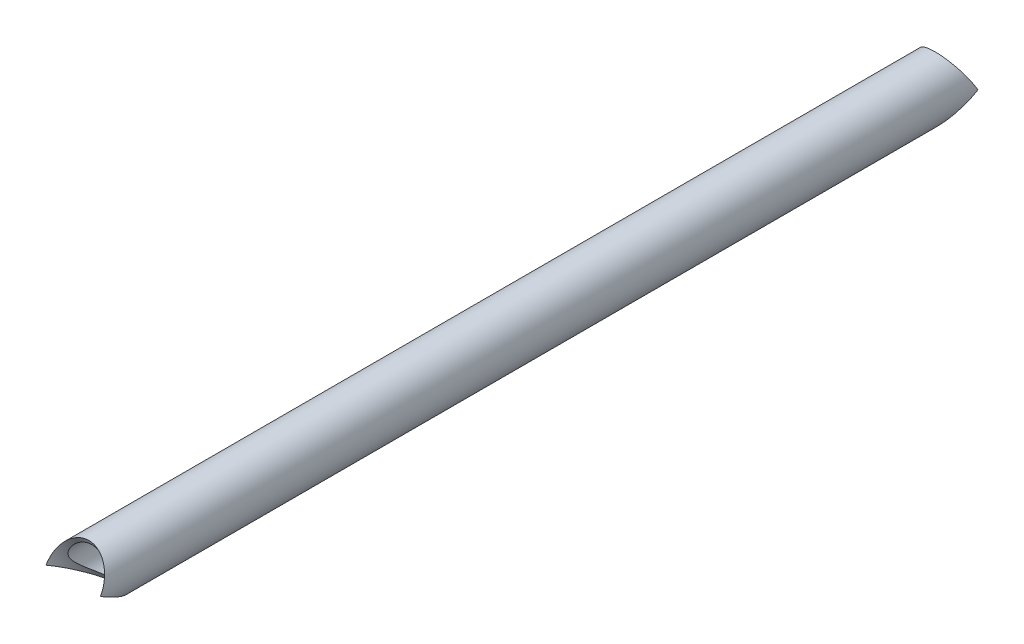
ISO-10303-21;
HEADER;
FILE_DESCRIPTION(('STEP AP214'),'2;1');
FILE_NAME('part.step','',(''),(''),'','','');
FILE_SCHEMA(('AUTOMOTIVE_DESIGN { 1 0 10303 214 1 1 1 1 }'));
ENDSEC;
DATA;
#1=APPLICATION_CONTEXT('core data for automotive mechanical design processes');
#2=APPLICATION_PROTOCOL_DEFINITION('international standard','automotive_design',2000,#1);
#3=PRODUCT_CONTEXT('',#1,'mechanical');
#4=PRODUCT('Part','Part','',(#3));
#5=PRODUCT_RELATED_PRODUCT_CATEGORY('part','',(#4));
#6=PRODUCT_DEFINITION_FORMATION('','',#4);
#7=PRODUCT_DEFINITION_CONTEXT('part definition',#1,'design');
#8=PRODUCT_DEFINITION('design','',#6,#7);
#9=PRODUCT_DEFINITION_SHAPE('','',#8);
#10=(LENGTH_UNIT() NAMED_UNIT(*) SI_UNIT(.MILLI.,.METRE.));
#11=(NAMED_UNIT(*) PLANE_ANGLE_UNIT() SI_UNIT($,.RADIAN.));
#12=(NAMED_UNIT(*) SI_UNIT($,.STERADIAN.) SOLID_ANGLE_UNIT());
#13=UNCERTAINTY_MEASURE_WITH_UNIT(LENGTH_MEASURE(1.E-05),#10,'distance_accuracy_value','');
#14=(GEOMETRIC_REPRESENTATION_CONTEXT(3) GLOBAL_UNCERTAINTY_ASSIGNED_CONTEXT((#13)) GLOBAL_UNIT_ASSIGNED_CONTEXT((#10,
#11,#12)) REPRESENTATION_CONTEXT('',''));
#15=CARTESIAN_POINT('',(0.,0.,0.));
#16=DIRECTION('',(0.,0.,1.));
#17=DIRECTION('',(1.,0.,0.));
#18=AXIS2_PLACEMENT_3D('',#15,#16,#17);
#19=CARTESIAN_POINT('',(0.,-5.32499999998885,-184.224170550283));
#20=DIRECTION('',(0.,0.,1.));
#21=DIRECTION('',(1.,0.,0.));
#22=AXIS2_PLACEMENT_3D('',#19,#20,#21);
#23=CYLINDRICAL_SURFACE('',#22,10.65);
#24=CARTESIAN_POINT('',(0.,-5.32499999998885,-171.925609816544));
#25=DIRECTION('',(0.,0.866025403784403,0.500000000000061));
#26=DIRECTION('',(0.,-0.500000000000061,0.866025403784403));
#27=AXIS2_PLACEMENT_3D('',#24,#25,#26);
#28=ELLIPSE('',#27,21.2999999999974,10.65);
#29=CARTESIAN_POINT('',(-10.65,-5.32499999998885,-171.925609816544));
#30=VERTEX_POINT('',#29);
#31=CARTESIAN_POINT('',(10.65,-5.32499999998885,-171.925609816544));
#32=VERTEX_POINT('',#31);
#33=EDGE_CURVE('E41',#30,#32,#28,.T.);
#34=ORIENTED_EDGE('',*,*,#33,.T.);
#35=CARTESIAN_POINT('',(0.,-5.32499999998885,-171.925609816544));
#36=DIRECTION('',(0.,-0.500000000000061,0.866025403784403));
#37=DIRECTION('',(0.,0.866025403784403,0.500000000000061));
#38=AXIS2_PLACEMENT_3D('',#35,#36,#37);
#39=ELLIPSE('',#38,12.2975607337395,10.65);
#40=EDGE_CURVE('E47',#32,#30,#39,.T.);
#41=ORIENTED_EDGE('',*,*,#40,.T.);
#42=EDGE_LOOP('',(#34,#41));
#43=FACE_BOUND('',#42,.T.);
#44=CARTESIAN_POINT('',(0.,-5.32499999998885,171.925609816544));
#45=DIRECTION('',(0.,-0.866025403784403,0.500000000000061));
#46=DIRECTION('',(0.,-0.500000000000061,-0.866025403784403));
#47=AXIS2_PLACEMENT_3D('',#44,#45,#46);
#48=ELLIPSE('',#47,21.2999999999974,10.65);
#49=CARTESIAN_POINT('',(-10.65,-5.32499999998885,171.925609816544));
#50=VERTEX_POINT('',#49);
#51=CARTESIAN_POINT('',(10.65,-5.32499999998885,171.925609816544));
#52=VERTEX_POINT('',#51);
#53=EDGE_CURVE('E66',#50,#52,#48,.T.);
#54=ORIENTED_EDGE('',*,*,#53,.F.);
#55=CARTESIAN_POINT('',(0.,-5.32499999998885,171.925609816544));
#56=DIRECTION('',(0.,0.500000000000061,0.866025403784403));
#57=DIRECTION('',(0.,0.866025403784403,-0.500000000000061));
#58=AXIS2_PLACEMENT_3D('',#55,#56,#57);
#59=ELLIPSE('',#58,12.2975607337395,10.65);
#60=EDGE_CURVE('E62',#52,#50,#59,.T.);
#61=ORIENTED_EDGE('',*,*,#60,.F.);
#62=EDGE_LOOP('',(#54,#61));
#63=FACE_BOUND('',#62,.T.);
#64=ADVANCED_FACE('F36',(#43,#63),#23,.T.);
#65=CARTESIAN_POINT('',(0.,-5.32499999998885,-184.224170550283));
#66=DIRECTION('',(0.,0.,1.));
#67=DIRECTION('',(1.,0.,0.));
#68=AXIS2_PLACEMENT_3D('',#65,#66,#67);
#69=CYLINDRICAL_SURFACE('',#68,8.65);
#70=CARTESIAN_POINT('',(8.65,-5.32499999998885,-164.751582588643));
#71=CARTESIAN_POINT('',(8.64999937803326,-5.17818391802983,-164.836346880927));
#72=CARTESIAN_POINT('',(8.64626274910706,-5.02875572477534,-164.916598939517));
#73=CARTESIAN_POINT('',(8.63051404007006,-4.72515065143808,-165.066664752137));
#74=CARTESIAN_POINT('',(8.61850310980505,-4.57097443401232,-165.136479954894));
#75=CARTESIAN_POINT('',(8.58549136002908,-4.258977668166,-165.264392027061));
#76=CARTESIAN_POINT('',(8.56450206368755,-4.10116203549409,-165.32250377699));
#77=CARTESIAN_POINT('',(8.51297710355421,-3.78302790283956,-165.426364076008));
#78=CARTESIAN_POINT('',(8.48244146927592,-3.62270941059626,-165.472112663318));
#79=CARTESIAN_POINT('',(8.41148621827915,-3.30100459506672,-165.551150890317));
#80=CARTESIAN_POINT('',(8.37105601253787,-3.13961730920164,-165.58442708501));
#81=CARTESIAN_POINT('',(8.2803069748769,-2.81761051835733,-165.638973092547));
#82=CARTESIAN_POINT('',(8.22998781020885,-2.65699103939996,-165.660242501288));
#83=CARTESIAN_POINT('',(8.11955918288833,-2.33771822962291,-165.691868713454));
#84=CARTESIAN_POINT('',(8.05943008935704,-2.17906954213242,-165.702203318022));
#85=CARTESIAN_POINT('',(7.92980127101956,-1.86529040441174,-165.713292877662));
#86=CARTESIAN_POINT('',(7.86029883349651,-1.7101609879251,-165.714045053469));
#87=CARTESIAN_POINT('',(7.69251740767304,-1.3634301509233,-165.706625782818));
#88=CARTESIAN_POINT('',(7.5915181509432,-1.17319572046901,-165.696008886837));
#89=CARTESIAN_POINT('',(7.37601667855867,-0.801384915047754,-165.664903576289));
#90=CARTESIAN_POINT('',(7.26151062378719,-0.619811022411486,-165.644412349952));
#91=CARTESIAN_POINT('',(7.01974442801425,-0.266185998617423,-165.596289892607));
#92=CARTESIAN_POINT('',(6.89247464409701,-0.0941422220586872,-165.568653238017));
#93=CARTESIAN_POINT('',(6.62602035216088,0.239525172013357,-165.508607871293));
#94=CARTESIAN_POINT('',(6.48683667995883,0.401149519107631,-165.476199493802));
#95=CARTESIAN_POINT('',(6.19369921715697,0.717199408943917,-165.407764760115));
#96=CARTESIAN_POINT('',(6.03946719637204,0.871351742221771,-165.371669240243));
#97=CARTESIAN_POINT('',(5.71996280967908,1.16745458199548,-165.298337988744));
#98=CARTESIAN_POINT('',(5.55469039583109,1.3094050355018,-165.261102252166));
#99=CARTESIAN_POINT('',(5.21389860047888,1.58044322936016,-165.187000834841));
#100=CARTESIAN_POINT('',(5.03838164399918,1.70953399435173,-165.150135068918));
#101=CARTESIAN_POINT('',(4.67787691764106,1.95424676281789,-165.078035733563));
#102=CARTESIAN_POINT('',(4.49288897525142,2.06986852083276,-165.042802193884));
#103=CARTESIAN_POINT('',(4.08963935720716,2.30115050105448,-164.970633423202));
#104=CARTESIAN_POINT('',(3.87018262639214,2.41485316134383,-164.934074544985));
#105=CARTESIAN_POINT('',(3.42170434916094,2.62330748090905,-164.865738468766));
#106=CARTESIAN_POINT('',(3.19268197861112,2.71805750322058,-164.833961683857));
#107=CARTESIAN_POINT('',(2.7266723382205,2.88774898225467,-164.776260503516));
#108=CARTESIAN_POINT('',(2.48968464132695,2.96268937498884,-164.750336422447));
#109=CARTESIAN_POINT('',(2.00954587057522,3.09200831167104,-164.705186159598));
#110=CARTESIAN_POINT('',(1.76639521488977,3.14638824673532,-164.685959524677));
#111=CARTESIAN_POINT('',(1.28688815577943,3.23204637631907,-164.655511643798));
#112=CARTESIAN_POINT('',(1.05071773862522,3.26425324185667,-164.643969360825));
#113=CARTESIAN_POINT('',(0.576287751521727,3.3090696993199,-164.627876538484));
#114=CARTESIAN_POINT('',(0.338028232848643,3.32167977089473,-164.623325827991));
#115=CARTESIAN_POINT('',(-0.138694398066291,3.32717181020632,-164.621345993312));
#116=CARTESIAN_POINT('',(-0.377157454410702,3.32005809031574,-164.623915312416));
#117=CARTESIAN_POINT('',(-0.852499060908972,3.28618555814927,-164.636099206851));
#118=CARTESIAN_POINT('',(-1.08937763950013,3.25942709940566,-164.645713655395));
#119=CARTESIAN_POINT('',(-1.55084699910064,3.18792048411242,-164.671219634468));
#120=CARTESIAN_POINT('',(-1.7755636187999,3.14389120637699,-164.686859931666));
#121=CARTESIAN_POINT('',(-2.22033596035186,3.03830373528607,-164.723988694614));
#122=CARTESIAN_POINT('',(-2.4403918288897,2.97674609447402,-164.745476976018));
#123=CARTESIAN_POINT('',(-2.87439182216489,2.83663978905833,-164.793716157701));
#124=CARTESIAN_POINT('',(-3.08833678882606,2.75809347796042,-164.820466328983));
#125=CARTESIAN_POINT('',(-3.50884695015104,2.58462882673776,-164.878485954288));
#126=CARTESIAN_POINT('',(-3.7154119251496,2.48970999977479,-164.909755542691));
#127=CARTESIAN_POINT('',(-4.12561504865976,2.28132550281853,-164.976824530928));
#128=CARTESIAN_POINT('',(-4.32901148650181,2.16741694086198,-165.012725829159));
#129=CARTESIAN_POINT('',(-4.72560996425249,1.92381198974504,-165.087156214731));
#130=CARTESIAN_POINT('',(-4.91881176220239,1.79411522611015,-165.125685364393));
#131=CARTESIAN_POINT('',(-5.29426000335307,1.51952202324252,-165.204019326205));
#132=CARTESIAN_POINT('',(-5.4764901297915,1.37460378461324,-165.243825909613));
#133=CARTESIAN_POINT('',(-5.82873985001166,1.07050122086712,-165.322975853411));
#134=CARTESIAN_POINT('',(-5.99875927649522,0.91131670035584,-165.362319207448));
#135=CARTESIAN_POINT('',(-6.33518765877074,0.569797671442788,-165.440740789647));
#136=CARTESIAN_POINT('',(-6.50081325634465,0.38665555923292,-165.479670874362));
#137=CARTESIAN_POINT('',(-6.81634213928583,0.00614173896049025,-165.551855359216));
#138=CARTESIAN_POINT('',(-6.96624167784346,-0.191233341360134,-165.585108407952));
#139=CARTESIAN_POINT('',(-7.24880778217058,-0.598626237502179,-165.642302626018));
#140=CARTESIAN_POINT('',(-7.38151120832292,-0.808615550176427,-165.666263939914));
#141=CARTESIAN_POINT('',(-7.62872444595338,-1.24005747420905,-165.700706798244));
#142=CARTESIAN_POINT('',(-7.74324661530789,-1.46150216238931,-165.711197533363));
#143=CARTESIAN_POINT('',(-7.91587661528823,-1.83394120081,-165.713453861845));
#144=CARTESIAN_POINT('',(-7.97965328460164,-1.98229882169847,-165.71051051142));
#145=CARTESIAN_POINT('',(-8.09865941914437,-2.28194667177127,-165.695658752971));
#146=CARTESIAN_POINT('',(-8.15389168150628,-2.43323592291714,-165.683753286341));
#147=CARTESIAN_POINT('',(-8.25543809691553,-2.73735751111757,-165.649851195522));
#148=CARTESIAN_POINT('',(-8.30176915263798,-2.89018633175618,-165.627873971049));
#149=CARTESIAN_POINT('',(-8.38549388456925,-3.19634433804125,-165.572985934839));
#150=CARTESIAN_POINT('',(-8.42288752849283,-3.3496735254932,-165.540075083608));
#151=CARTESIAN_POINT('',(-8.48887463244825,-3.65583736996734,-165.462819916907));
#152=CARTESIAN_POINT('',(-8.51744234753774,-3.80866931716127,-165.418442833481));
#153=CARTESIAN_POINT('',(-8.56590540255694,-4.11200299043332,-165.318457093415));
#154=CARTESIAN_POINT('',(-8.58580081854741,-4.26250473693738,-165.262848535289));
#155=CARTESIAN_POINT('',(-8.61742448664859,-4.56019147254828,-165.140996012762));
#156=CARTESIAN_POINT('',(-8.62914387610778,-4.70737269562372,-165.074740602767));
#157=CARTESIAN_POINT('',(-8.64501885033618,-4.99748069426516,-164.932658779803));
#158=CARTESIAN_POINT('',(-8.64917188260002,-5.14040601811811,-164.856829146197));
#159=CARTESIAN_POINT('',(-8.65091176420886,-5.4819498637693,-164.662429780555));
#160=CARTESIAN_POINT('',(-8.64490991978812,-5.67810720220343,-164.539496812136));
#161=CARTESIAN_POINT('',(-8.62080404537332,-6.06052557384161,-164.28018583847));
#162=CARTESIAN_POINT('',(-8.60269349220145,-6.24678121440884,-164.143800620032));
#163=CARTESIAN_POINT('',(-8.5559159317615,-6.61050738598074,-163.86036625578));
#164=CARTESIAN_POINT('',(-8.52721453919814,-6.78794714118488,-163.713283641723));
#165=CARTESIAN_POINT('',(-8.46048539057335,-7.13436872184306,-163.411410831022));
#166=CARTESIAN_POINT('',(-8.4224538533154,-7.30334708466182,-163.256617529814));
#167=CARTESIAN_POINT('',(-8.33930780952946,-7.62840220803287,-162.9465277733));
#168=CARTESIAN_POINT('',(-8.29446233610359,-7.78471951599551,-162.791409697928));
#169=CARTESIAN_POINT('',(-8.19738755510059,-8.09107106240671,-162.477399875386));
#170=CARTESIAN_POINT('',(-8.1451593511144,-8.24110623558898,-162.31850869518));
#171=CARTESIAN_POINT('',(-8.03358147622644,-8.53574819847153,-161.997939035238));
#172=CARTESIAN_POINT('',(-7.97422521882754,-8.68034980293632,-161.83625809765));
#173=CARTESIAN_POINT('',(-7.84858289044828,-8.96455859803898,-161.511183076435));
#174=CARTESIAN_POINT('',(-7.78229605383354,-9.10416523458176,-161.347788805331));
#175=CARTESIAN_POINT('',(-7.6427878968921,-9.37889196674545,-161.020007469417));
#176=CARTESIAN_POINT('',(-7.56956237191914,-9.51400927412034,-160.855619859886));
#177=CARTESIAN_POINT('',(-7.41613086611596,-9.7800058910372,-160.52664592058));
#178=CARTESIAN_POINT('',(-7.33592422353146,-9.9108847971956,-160.362059573429));
#179=CARTESIAN_POINT('',(-7.1684296718615,-10.1685222937733,-160.033473896981));
#180=CARTESIAN_POINT('',(-7.08114669097994,-10.2952836670593,-159.869474240805));
#181=CARTESIAN_POINT('',(-6.89920629382398,-10.5448944677749,-159.542591380739));
#182=CARTESIAN_POINT('',(-6.80454875727009,-10.6677438313533,-159.379708195105));
#183=CARTESIAN_POINT('',(-6.56519981119286,-10.9615247675292,-158.986076960969));
#184=CARTESIAN_POINT('',(-6.4164866166655,-11.1304340932328,-158.75624248383));
#185=CARTESIAN_POINT('',(-6.10210401419186,-11.4600386200723,-158.302234552357));
#186=CARTESIAN_POINT('',(-5.936432047359,-11.6207325761008,-158.078061958719));
#187=CARTESIAN_POINT('',(-5.58706670598721,-11.9327156751241,-157.63844317478));
#188=CARTESIAN_POINT('',(-5.40341885193566,-12.0840270661952,-157.422976799187));
#189=CARTESIAN_POINT('',(-5.01605964051008,-12.3762758979123,-157.003381560196));
#190=CARTESIAN_POINT('',(-4.81235869354435,-12.5172186556401,-156.799246899212));
#191=CARTESIAN_POINT('',(-4.4639543153783,-12.7358360010011,-156.480491065257));
#192=CARTESIAN_POINT('',(-4.3259696508585,-12.8173265353531,-156.361142903234));
#193=CARTESIAN_POINT('',(-4.04104693269511,-12.9747682172272,-156.129707893464));
#194=CARTESIAN_POINT('',(-3.89410768994088,-13.0507186261012,-156.017622014197));
#195=CARTESIAN_POINT('',(-3.43953622820843,-13.2688634311999,-155.694661392557));
#196=CARTESIAN_POINT('',(-3.11767000653625,-13.4016605290733,-155.496631189463));
#197=CARTESIAN_POINT('',(-2.51329904826432,-13.6064868217812,-155.189928205388));
#198=CARTESIAN_POINT('',(-2.23837288737338,-13.6854670464504,-155.071175308341));
#199=CARTESIAN_POINT('',(-1.81149183588576,-13.7844559440206,-154.922023838077));
#200=CARTESIAN_POINT('',(-1.66677696284482,-13.8142061118138,-154.877135149504));
#201=CARTESIAN_POINT('',(-1.37323763265841,-13.8665986633698,-154.798014086325));
#202=CARTESIAN_POINT('',(-1.22441515227444,-13.8892444033775,-154.763776679947));
#203=CARTESIAN_POINT('',(-0.92222853053509,-13.927057552641,-154.706576123065));
#204=CARTESIAN_POINT('',(-0.768835207762979,-13.9421542687202,-154.683719557076));
#205=CARTESIAN_POINT('',(-0.460111209939368,-13.9641399656126,-154.650424523793));
#206=CARTESIAN_POINT('',(-0.30478055029697,-13.9710290116656,-154.639985957793));
#207=CARTESIAN_POINT('',(0.00631804623091428,-13.9763962343476,-154.631853771358));
#208=CARTESIAN_POINT('',(0.162085851106537,-13.9748767236336,-154.634156646566));
#209=CARTESIAN_POINT('',(0.472597570432583,-13.963477071737,-154.6514270052));
#210=CARTESIAN_POINT('',(0.627341552834114,-13.9535974911377,-154.666393639458));
#211=CARTESIAN_POINT('',(0.914629127248838,-13.9275579323701,-154.705814759998));
#212=CARTESIAN_POINT('',(1.04746675019242,-13.9123698976713,-154.728800235879));
#213=CARTESIAN_POINT('',(1.31053948151334,-13.8761774918201,-154.783530232435));
#214=CARTESIAN_POINT('',(1.44077378597027,-13.855171352867,-154.815277415298));
#215=CARTESIAN_POINT('',(1.82650942834299,-13.7839970078783,-154.922738637026));
#216=CARTESIAN_POINT('',(2.07716005820093,-13.7256618014323,-155.010689174876));
#217=CARTESIAN_POINT('',(2.67701044964109,-13.558706736957,-155.261634615426));
#218=CARTESIAN_POINT('',(3.01657143771813,-13.4393597726738,-155.44043801723));
#219=CARTESIAN_POINT('',(3.49694388024296,-13.2385470086014,-155.739347740676));
#220=CARTESIAN_POINT('',(3.6524529174968,-13.1678539232102,-155.844283741456));
#221=CARTESIAN_POINT('',(3.95415605806183,-13.0201478760406,-156.062763025789));
#222=CARTESIAN_POINT('',(4.10035178316862,-12.9431360199697,-156.176304803174));
#223=CARTESIAN_POINT('',(4.47217067277701,-12.733913625142,-156.483531450296));
#224=CARTESIAN_POINT('',(4.69046621582068,-12.5972318743017,-156.683035934373));
#225=CARTESIAN_POINT('',(5.10542040241962,-12.3121722294261,-157.095775253172));
#226=CARTESIAN_POINT('',(5.3020644582469,-12.1637865639999,-157.30901919338));
#227=CARTESIAN_POINT('',(5.67619689273712,-11.8566202487968,-157.746177363489));
#228=CARTESIAN_POINT('',(5.85361633779411,-11.6978052714801,-157.970126094471));
#229=CARTESIAN_POINT('',(6.19021131259969,-11.3713821226177,-158.425040991472));
#230=CARTESIAN_POINT('',(6.34939068740904,-11.2037758152102,-158.656005665473));
#231=CARTESIAN_POINT('',(6.61712450602693,-10.8988278054151,-159.070274217507));
#232=CARTESIAN_POINT('',(6.72902472853526,-10.7631322708427,-159.252645771864));
#233=CARTESIAN_POINT('',(6.94326792392691,-10.4867928999609,-159.619279912858));
#234=CARTESIAN_POINT('',(7.04560988610065,-10.3461485425131,-159.803542697195));
#235=CARTESIAN_POINT('',(7.24122557898454,-10.05968727115,-160.173200632311));
#236=CARTESIAN_POINT('',(7.33449006193028,-9.91386528461952,-160.358596737538));
#237=CARTESIAN_POINT('',(7.51210861764644,-9.616929029369,-160.729402184697));
#238=CARTESIAN_POINT('',(7.59646314201647,-9.46581502939117,-160.914811525481));
#239=CARTESIAN_POINT('',(7.75620337110361,-9.15824485940918,-161.284195227625));
#240=CARTESIAN_POINT('',(7.83161100983146,-9.00180301724745,-161.468172019951));
#241=CARTESIAN_POINT('',(7.97368173187742,-8.68259257521454,-161.834056311648));
#242=CARTESIAN_POINT('',(8.04034383363396,-8.51982326782891,-162.015963576657));
#243=CARTESIAN_POINT('',(8.164596709317,-8.18739573465147,-162.37608482763));
#244=CARTESIAN_POINT('',(8.22219981237255,-8.01774727407237,-162.5543035415));
#245=CARTESIAN_POINT('',(8.32794134031472,-7.67039006344912,-162.905561180118));
#246=CARTESIAN_POINT('',(8.3760828421222,-7.49268395697198,-163.078601773225));
#247=CARTESIAN_POINT('',(8.45472823516461,-7.15916947841743,-163.388375195574));
#248=CARTESIAN_POINT('',(8.48684042866996,-7.00481212054896,-163.526257229818));
#249=CARTESIAN_POINT('',(8.54328935211189,-6.6889815087258,-163.795370466504));
#250=CARTESIAN_POINT('',(8.56762596647505,-6.52750814904201,-163.926601570066));
#251=CARTESIAN_POINT('',(8.60751619567126,-6.19721879364405,-164.180090814596));
#252=CARTESIAN_POINT('',(8.62309164938045,-6.02842219523584,-164.302370599922));
#253=CARTESIAN_POINT('',(8.6443326388658,-5.68273682259956,-164.535908107681));
#254=CARTESIAN_POINT('',(8.65000076614763,-5.50585017694943,-164.647168705267));
#255=CARTESIAN_POINT('',(8.65,-5.32499999998885,-164.751582588643));
#256=B_SPLINE_CURVE_WITH_KNOTS('',3,(#70,#71,#72,#73,#74,#75,#76,#77,#78,#79,#80,#81,#82,#83,
#84,#85,#86,#87,#88,#89,#90,#91,#92,#93,#94,#95,#96,#97,#98,#99,#100,#101,#102,#103,#104,#105,
#106,#107,#108,#109,#110,#111,#112,#113,#114,#115,#116,#117,#118,#119,#120,#121,#122,#123,#124,
#125,#126,#127,#128,#129,#130,#131,#132,#133,#134,#135,#136,#137,#138,#139,#140,#141,#142,#143,
#144,#145,#146,#147,#148,#149,#150,#151,#152,#153,#154,#155,#156,#157,#158,#159,#160,#161,#162,
#163,#164,#165,#166,#167,#168,#169,#170,#171,#172,#173,#174,#175,#176,#177,#178,#179,#180,#181,
#182,#183,#184,#185,#186,#187,#188,#189,#190,#191,#192,#193,#194,#195,#196,#197,#198,#199,#200,
#201,#202,#203,#204,#205,#206,#207,#208,#209,#210,#211,#212,#213,#214,#215,#216,#217,#218,#219,
#220,#221,#222,#223,#224,#225,#226,#227,#228,#229,#230,#231,#232,#233,#234,#235,#236,#237,#238,
#239,#240,#241,#242,#243,#244,#245,#246,#247,#248,#249,#250,#251,#252,#253,#254,#255),
.UNSPECIFIED.,.T.,.F.,(4,2,2,2,2,2,2,2,2,2,2,2,2,2,2,2,2,2,2,2,2,2,2,2,2,2,2,2,2,2,2,2,2,2,2,2,
2,2,2,2,2,2,2,2,2,2,2,2,2,2,2,2,2,2,2,2,2,2,2,2,2,2,2,2,2,2,2,2,2,2,2,2,2,2,2,2,2,2,2,2,2,2,2,2,
2,2,2,2,2,2,2,2,4),(0.,0.508445067700345,1.01681949312026,1.52454340032986,2.03226573787246,
2.54053382673744,3.04881902097656,3.55813412185337,4.06759693996554,4.71359002947273,
5.35976717786702,6.0064362401244,6.65305997254502,7.31551844685102,7.97797979789364,
8.64028496620576,9.3026022025059,10.0512091879154,10.7998808036047,11.5485926227779,
12.2972537751971,13.0122575701419,13.727243864449,14.4420738478249,15.1568909672333,
15.8446653307739,16.5324180161267,17.220075485415,17.9077534057859,18.6145823037833,
19.3214279700608,20.0293001149053,20.7371819564205,21.4861817527542,22.2353595985677,
22.9829040159493,23.7299381285012,24.2140392664685,24.6979815901785,25.1809956610562,
25.664011476733,26.1484232132306,26.6328307010898,27.117762464654,27.6028577893435,
28.2964167818695,28.9903497083936,29.6865557409419,30.3830443900297,31.056994465983,
31.7308439043487,32.4053208577863,33.0798724008733,33.754835349197,34.4298623484515,
35.1044232089342,35.7789950738535,36.7434305731184,37.708011809881,38.6702106916393,
39.6319126633936,40.2309613246269,40.8300897097659,42.0261773485567,42.9515592316293,
43.4142860297687,43.8767938980607,44.3435554209346,44.8103132336666,45.2769426775161,
45.7435408340748,46.1500870679648,46.5567569645808,47.3697458590118,48.5683011522666,
49.1693990091061,49.7703919045984,50.7462014804335,51.7226645377543,52.7025204724634,
53.6821694691645,54.4420360299658,55.2019828498199,55.962695941976,56.7233704590089,
57.4821398028627,58.2409942350115,58.9988067717561,59.7563724579483,60.3844095628076,
61.0124560021506,61.6389298975942,62.2652398987969),.UNSPECIFIED.);
#257=CARTESIAN_POINT('',(8.65,-5.32499999998885,-164.751582588643));
#258=VERTEX_POINT('',#257);
#259=EDGE_CURVE('E11',#258,#258,#256,.T.);
#260=ORIENTED_EDGE('',*,*,#259,.F.);
#261=EDGE_LOOP('',(#260));
#262=FACE_BOUND('',#261,.T.);
#263=CARTESIAN_POINT('',(8.65,-5.32499999998885,164.751582588643));
#264=CARTESIAN_POINT('',(8.64999937803326,-5.17818391802983,164.836346880927));
#265=CARTESIAN_POINT('',(8.64626274910706,-5.02875572477534,164.916598939517));
#266=CARTESIAN_POINT('',(8.63051404007006,-4.72515065143808,165.066664752137));
#267=CARTESIAN_POINT('',(8.61850310980505,-4.57097443401232,165.136479954894));
#268=CARTESIAN_POINT('',(8.58549136002908,-4.258977668166,165.264392027061));
#269=CARTESIAN_POINT('',(8.56450206368755,-4.10116203549409,165.32250377699));
#270=CARTESIAN_POINT('',(8.51297710355421,-3.78302790283956,165.426364076008));
#271=CARTESIAN_POINT('',(8.48244146927592,-3.62270941059626,165.472112663318));
#272=CARTESIAN_POINT('',(8.41148621827915,-3.30100459506672,165.551150890317));
#273=CARTESIAN_POINT('',(8.37105601253787,-3.13961730920164,165.58442708501));
#274=CARTESIAN_POINT('',(8.2803069748769,-2.81761051835733,165.638973092547));
#275=CARTESIAN_POINT('',(8.22998781020885,-2.65699103939996,165.660242501288));
#276=CARTESIAN_POINT('',(8.11955918288833,-2.33771822962291,165.691868713454));
#277=CARTESIAN_POINT('',(8.05943008935704,-2.17906954213242,165.702203318022));
#278=CARTESIAN_POINT('',(7.92980127101956,-1.86529040441174,165.713292877662));
#279=CARTESIAN_POINT('',(7.86029883349651,-1.7101609879251,165.714045053469));
#280=CARTESIAN_POINT('',(7.69251740767304,-1.3634301509233,165.706625782818));
#281=CARTESIAN_POINT('',(7.5915181509432,-1.17319572046901,165.696008886837));
#282=CARTESIAN_POINT('',(7.37601667855867,-0.801384915047754,165.664903576289));
#283=CARTESIAN_POINT('',(7.26151062378719,-0.619811022411486,165.644412349952));
#284=CARTESIAN_POINT('',(7.01974442801425,-0.266185998617423,165.596289892607));
#285=CARTESIAN_POINT('',(6.89247464409701,-0.0941422220586872,165.568653238017));
#286=CARTESIAN_POINT('',(6.62602035216088,0.239525172013357,165.508607871293));
#287=CARTESIAN_POINT('',(6.48683667995883,0.401149519107631,165.476199493802));
#288=CARTESIAN_POINT('',(6.19369921715697,0.717199408943917,165.407764760115));
#289=CARTESIAN_POINT('',(6.03946719637204,0.871351742221771,165.371669240243));
#290=CARTESIAN_POINT('',(5.71996280967908,1.16745458199548,165.298337988744));
#291=CARTESIAN_POINT('',(5.55469039583109,1.3094050355018,165.261102252166));
#292=CARTESIAN_POINT('',(5.21389860047888,1.58044322936016,165.187000834841));
#293=CARTESIAN_POINT('',(5.03838164399918,1.70953399435173,165.150135068918));
#294=CARTESIAN_POINT('',(4.67787691764106,1.95424676281789,165.078035733563));
#295=CARTESIAN_POINT('',(4.49288897525142,2.06986852083276,165.042802193884));
#296=CARTESIAN_POINT('',(4.08963935720716,2.30115050105448,164.970633423202));
#297=CARTESIAN_POINT('',(3.87018262639214,2.41485316134383,164.934074544985));
#298=CARTESIAN_POINT('',(3.42170434916094,2.62330748090905,164.865738468766));
#299=CARTESIAN_POINT('',(3.19268197861112,2.71805750322058,164.833961683857));
#300=CARTESIAN_POINT('',(2.7266723382205,2.88774898225467,164.776260503516));
#301=CARTESIAN_POINT('',(2.48968464132695,2.96268937498884,164.750336422447));
#302=CARTESIAN_POINT('',(2.00954587057522,3.09200831167104,164.705186159598));
#303=CARTESIAN_POINT('',(1.76639521488977,3.14638824673532,164.685959524677));
#304=CARTESIAN_POINT('',(1.28688815577943,3.23204637631907,164.655511643798));
#305=CARTESIAN_POINT('',(1.05071773862522,3.26425324185667,164.643969360825));
#306=CARTESIAN_POINT('',(0.576287751521727,3.3090696993199,164.627876538484));
#307=CARTESIAN_POINT('',(0.338028232848643,3.32167977089473,164.623325827991));
#308=CARTESIAN_POINT('',(-0.138694398066291,3.32717181020632,164.621345993312));
#309=CARTESIAN_POINT('',(-0.377157454410702,3.32005809031574,164.623915312416));
#310=CARTESIAN_POINT('',(-0.852499060908972,3.28618555814927,164.636099206851));
#311=CARTESIAN_POINT('',(-1.08937763950013,3.25942709940566,164.645713655395));
#312=CARTESIAN_POINT('',(-1.55084699910064,3.18792048411242,164.671219634468));
#313=CARTESIAN_POINT('',(-1.7755636187999,3.14389120637699,164.686859931666));
#314=CARTESIAN_POINT('',(-2.22033596035186,3.03830373528607,164.723988694614));
#315=CARTESIAN_POINT('',(-2.4403918288897,2.97674609447402,164.745476976018));
#316=CARTESIAN_POINT('',(-2.87439182216489,2.83663978905833,164.793716157701));
#317=CARTESIAN_POINT('',(-3.08833678882606,2.75809347796042,164.820466328983));
#318=CARTESIAN_POINT('',(-3.50884695015104,2.58462882673776,164.878485954288));
#319=CARTESIAN_POINT('',(-3.7154119251496,2.48970999977479,164.909755542691));
#320=CARTESIAN_POINT('',(-4.12561504865976,2.28132550281853,164.976824530928));
#321=CARTESIAN_POINT('',(-4.32901148650181,2.16741694086198,165.012725829159));
#322=CARTESIAN_POINT('',(-4.72560996425249,1.92381198974504,165.087156214731));
#323=CARTESIAN_POINT('',(-4.91881176220239,1.79411522611015,165.125685364393));
#324=CARTESIAN_POINT('',(-5.29426000335307,1.51952202324252,165.204019326205));
#325=CARTESIAN_POINT('',(-5.4764901297915,1.37460378461324,165.243825909613));
#326=CARTESIAN_POINT('',(-5.82873985001166,1.07050122086712,165.322975853411));
#327=CARTESIAN_POINT('',(-5.99875927649522,0.91131670035584,165.362319207448));
#328=CARTESIAN_POINT('',(-6.33518765877074,0.569797671442788,165.440740789647));
#329=CARTESIAN_POINT('',(-6.50081325634465,0.38665555923292,165.479670874362));
#330=CARTESIAN_POINT('',(-6.81634213928583,0.00614173896049025,165.551855359216));
#331=CARTESIAN_POINT('',(-6.96624167784346,-0.191233341360134,165.585108407952));
#332=CARTESIAN_POINT('',(-7.24880778217058,-0.598626237502179,165.642302626018));
#333=CARTESIAN_POINT('',(-7.38151120832292,-0.808615550176427,165.666263939914));
#334=CARTESIAN_POINT('',(-7.62872444595338,-1.24005747420905,165.700706798244));
#335=CARTESIAN_POINT('',(-7.74324661530789,-1.46150216238931,165.711197533363));
#336=CARTESIAN_POINT('',(-7.91587661528823,-1.83394120081,165.713453861845));
#337=CARTESIAN_POINT('',(-7.97965328460164,-1.98229882169847,165.71051051142));
#338=CARTESIAN_POINT('',(-8.09865941914437,-2.28194667177127,165.695658752971));
#339=CARTESIAN_POINT('',(-8.15389168150628,-2.43323592291714,165.683753286341));
#340=CARTESIAN_POINT('',(-8.25543809691553,-2.73735751111757,165.649851195522));
#341=CARTESIAN_POINT('',(-8.30176915263798,-2.89018633175618,165.627873971049));
#342=CARTESIAN_POINT('',(-8.38549388456925,-3.19634433804125,165.572985934839));
#343=CARTESIAN_POINT('',(-8.42288752849283,-3.3496735254932,165.540075083608));
#344=CARTESIAN_POINT('',(-8.48887463244825,-3.65583736996734,165.462819916907));
#345=CARTESIAN_POINT('',(-8.51744234753774,-3.80866931716127,165.418442833481));
#346=CARTESIAN_POINT('',(-8.56590540255694,-4.11200299043332,165.318457093415));
#347=CARTESIAN_POINT('',(-8.58580081854741,-4.26250473693738,165.262848535289));
#348=CARTESIAN_POINT('',(-8.61742448664859,-4.56019147254828,165.140996012762));
#349=CARTESIAN_POINT('',(-8.62914387610778,-4.70737269562372,165.074740602767));
#350=CARTESIAN_POINT('',(-8.64501885033618,-4.99748069426516,164.932658779803));
#351=CARTESIAN_POINT('',(-8.64917188260002,-5.14040601811811,164.856829146197));
#352=CARTESIAN_POINT('',(-8.65091176420886,-5.4819498637693,164.662429780555));
#353=CARTESIAN_POINT('',(-8.64490991978812,-5.67810720220343,164.539496812136));
#354=CARTESIAN_POINT('',(-8.62080404537332,-6.06052557384161,164.28018583847));
#355=CARTESIAN_POINT('',(-8.60269349220145,-6.24678121440884,164.143800620032));
#356=CARTESIAN_POINT('',(-8.5559159317615,-6.61050738598074,163.86036625578));
#357=CARTESIAN_POINT('',(-8.52721453919814,-6.78794714118488,163.713283641723));
#358=CARTESIAN_POINT('',(-8.46048539057335,-7.13436872184306,163.411410831022));
#359=CARTESIAN_POINT('',(-8.4224538533154,-7.30334708466182,163.256617529814));
#360=CARTESIAN_POINT('',(-8.33930780952946,-7.62840220803287,162.9465277733));
#361=CARTESIAN_POINT('',(-8.29446233610359,-7.78471951599551,162.791409697928));
#362=CARTESIAN_POINT('',(-8.19738755510059,-8.09107106240671,162.477399875386));
#363=CARTESIAN_POINT('',(-8.1451593511144,-8.24110623558898,162.31850869518));
#364=CARTESIAN_POINT('',(-8.03358147622644,-8.53574819847153,161.997939035238));
#365=CARTESIAN_POINT('',(-7.97422521882754,-8.68034980293632,161.83625809765));
#366=CARTESIAN_POINT('',(-7.84858289044828,-8.96455859803898,161.511183076435));
#367=CARTESIAN_POINT('',(-7.78229605383354,-9.10416523458176,161.347788805331));
#368=CARTESIAN_POINT('',(-7.6427878968921,-9.37889196674545,161.020007469417));
#369=CARTESIAN_POINT('',(-7.56956237191914,-9.51400927412034,160.855619859886));
#370=CARTESIAN_POINT('',(-7.41613086611596,-9.7800058910372,160.52664592058));
#371=CARTESIAN_POINT('',(-7.33592422353146,-9.9108847971956,160.362059573429));
#372=CARTESIAN_POINT('',(-7.1684296718615,-10.1685222937733,160.033473896981));
#373=CARTESIAN_POINT('',(-7.08114669097994,-10.2952836670593,159.869474240805));
#374=CARTESIAN_POINT('',(-6.89920629382398,-10.5448944677749,159.542591380739));
#375=CARTESIAN_POINT('',(-6.80454875727009,-10.6677438313533,159.379708195105));
#376=CARTESIAN_POINT('',(-6.56519981119286,-10.9615247675292,158.986076960969));
#377=CARTESIAN_POINT('',(-6.4164866166655,-11.1304340932328,158.75624248383));
#378=CARTESIAN_POINT('',(-6.10210401419186,-11.4600386200723,158.302234552357));
#379=CARTESIAN_POINT('',(-5.936432047359,-11.6207325761008,158.078061958719));
#380=CARTESIAN_POINT('',(-5.58706670598721,-11.9327156751241,157.63844317478));
#381=CARTESIAN_POINT('',(-5.40341885193566,-12.0840270661952,157.422976799187));
#382=CARTESIAN_POINT('',(-5.01605964051008,-12.3762758979123,157.003381560196));
#383=CARTESIAN_POINT('',(-4.81235869354435,-12.5172186556401,156.799246899212));
#384=CARTESIAN_POINT('',(-4.4639543153783,-12.7358360010011,156.480491065257));
#385=CARTESIAN_POINT('',(-4.3259696508585,-12.8173265353531,156.361142903234));
#386=CARTESIAN_POINT('',(-4.04104693269511,-12.9747682172272,156.129707893464));
#387=CARTESIAN_POINT('',(-3.89410768994088,-13.0507186261012,156.017622014197));
#388=CARTESIAN_POINT('',(-3.43953622820843,-13.2688634311999,155.694661392557));
#389=CARTESIAN_POINT('',(-3.11767000653625,-13.4016605290733,155.496631189463));
#390=CARTESIAN_POINT('',(-2.51329904826432,-13.6064868217812,155.189928205388));
#391=CARTESIAN_POINT('',(-2.23837288737338,-13.6854670464504,155.071175308341));
#392=CARTESIAN_POINT('',(-1.81149183588576,-13.7844559440206,154.922023838077));
#393=CARTESIAN_POINT('',(-1.66677696284482,-13.8142061118138,154.877135149504));
#394=CARTESIAN_POINT('',(-1.37323763265841,-13.8665986633698,154.798014086325));
#395=CARTESIAN_POINT('',(-1.22441515227444,-13.8892444033775,154.763776679947));
#396=CARTESIAN_POINT('',(-0.92222853053509,-13.927057552641,154.706576123065));
#397=CARTESIAN_POINT('',(-0.768835207762979,-13.9421542687202,154.683719557076));
#398=CARTESIAN_POINT('',(-0.460111209939368,-13.9641399656126,154.650424523793));
#399=CARTESIAN_POINT('',(-0.30478055029697,-13.9710290116656,154.639985957793));
#400=CARTESIAN_POINT('',(0.00631804623091428,-13.9763962343476,154.631853771358));
#401=CARTESIAN_POINT('',(0.162085851106537,-13.9748767236336,154.634156646566));
#402=CARTESIAN_POINT('',(0.472597570432583,-13.963477071737,154.6514270052));
#403=CARTESIAN_POINT('',(0.627341552834114,-13.9535974911377,154.666393639458));
#404=CARTESIAN_POINT('',(0.914629127248838,-13.9275579323701,154.705814759998));
#405=CARTESIAN_POINT('',(1.04746675019242,-13.9123698976713,154.728800235879));
#406=CARTESIAN_POINT('',(1.31053948151334,-13.8761774918201,154.783530232435));
#407=CARTESIAN_POINT('',(1.44077378597027,-13.855171352867,154.815277415298));
#408=CARTESIAN_POINT('',(1.82650942834299,-13.7839970078783,154.922738637026));
#409=CARTESIAN_POINT('',(2.07716005820093,-13.7256618014323,155.010689174876));
#410=CARTESIAN_POINT('',(2.67701044964109,-13.558706736957,155.261634615426));
#411=CARTESIAN_POINT('',(3.01657143771813,-13.4393597726738,155.44043801723));
#412=CARTESIAN_POINT('',(3.49694388024296,-13.2385470086014,155.739347740676));
#413=CARTESIAN_POINT('',(3.6524529174968,-13.1678539232102,155.844283741456));
#414=CARTESIAN_POINT('',(3.95415605806183,-13.0201478760406,156.062763025789));
#415=CARTESIAN_POINT('',(4.10035178316862,-12.9431360199697,156.176304803174));
#416=CARTESIAN_POINT('',(4.47217067277701,-12.733913625142,156.483531450296));
#417=CARTESIAN_POINT('',(4.69046621582068,-12.5972318743017,156.683035934373));
#418=CARTESIAN_POINT('',(5.10542040241962,-12.3121722294261,157.095775253172));
#419=CARTESIAN_POINT('',(5.3020644582469,-12.1637865639999,157.30901919338));
#420=CARTESIAN_POINT('',(5.67619689273712,-11.8566202487968,157.746177363489));
#421=CARTESIAN_POINT('',(5.85361633779411,-11.6978052714801,157.970126094471));
#422=CARTESIAN_POINT('',(6.19021131259969,-11.3713821226177,158.425040991472));
#423=CARTESIAN_POINT('',(6.34939068740904,-11.2037758152102,158.656005665473));
#424=CARTESIAN_POINT('',(6.61712450602693,-10.8988278054151,159.070274217507));
#425=CARTESIAN_POINT('',(6.72902472853526,-10.7631322708427,159.252645771864));
#426=CARTESIAN_POINT('',(6.94326792392691,-10.4867928999609,159.619279912858));
#427=CARTESIAN_POINT('',(7.04560988610065,-10.3461485425131,159.803542697195));
#428=CARTESIAN_POINT('',(7.24122557898454,-10.05968727115,160.173200632311));
#429=CARTESIAN_POINT('',(7.33449006193028,-9.91386528461952,160.358596737538));
#430=CARTESIAN_POINT('',(7.51210861764644,-9.616929029369,160.729402184697));
#431=CARTESIAN_POINT('',(7.59646314201647,-9.46581502939117,160.914811525481));
#432=CARTESIAN_POINT('',(7.75620337110361,-9.15824485940918,161.284195227625));
#433=CARTESIAN_POINT('',(7.83161100983146,-9.00180301724745,161.468172019951));
#434=CARTESIAN_POINT('',(7.97368173187742,-8.68259257521454,161.834056311648));
#435=CARTESIAN_POINT('',(8.04034383363396,-8.51982326782891,162.015963576657));
#436=CARTESIAN_POINT('',(8.164596709317,-8.18739573465147,162.37608482763));
#437=CARTESIAN_POINT('',(8.22219981237255,-8.01774727407237,162.5543035415));
#438=CARTESIAN_POINT('',(8.32794134031472,-7.67039006344912,162.905561180118));
#439=CARTESIAN_POINT('',(8.3760828421222,-7.49268395697198,163.078601773225));
#440=CARTESIAN_POINT('',(8.45472823516461,-7.15916947841743,163.388375195574));
#441=CARTESIAN_POINT('',(8.48684042866996,-7.00481212054896,163.526257229818));
#442=CARTESIAN_POINT('',(8.54328935211189,-6.6889815087258,163.795370466504));
#443=CARTESIAN_POINT('',(8.56762596647505,-6.52750814904201,163.926601570066));
#444=CARTESIAN_POINT('',(8.60751619567126,-6.19721879364405,164.180090814596));
#445=CARTESIAN_POINT('',(8.62309164938045,-6.02842219523584,164.302370599922));
#446=CARTESIAN_POINT('',(8.6443326388658,-5.68273682259956,164.535908107681));
#447=CARTESIAN_POINT('',(8.65000076614763,-5.50585017694943,164.647168705267));
#448=CARTESIAN_POINT('',(8.65,-5.32499999998885,164.751582588643));
#449=B_SPLINE_CURVE_WITH_KNOTS('',3,(#263,#264,#265,#266,#267,#268,#269,#270,#271,#272,#273,
#274,#275,#276,#277,#278,#279,#280,#281,#282,#283,#284,#285,#286,#287,#288,#289,#290,#291,#292,
#293,#294,#295,#296,#297,#298,#299,#300,#301,#302,#303,#304,#305,#306,#307,#308,#309,#310,#311,
#312,#313,#314,#315,#316,#317,#318,#319,#320,#321,#322,#323,#324,#325,#326,#327,#328,#329,#330,
#331,#332,#333,#334,#335,#336,#337,#338,#339,#340,#341,#342,#343,#344,#345,#346,#347,#348,#349,
#350,#351,#352,#353,#354,#355,#356,#357,#358,#359,#360,#361,#362,#363,#364,#365,#366,#367,#368,
#369,#370,#371,#372,#373,#374,#375,#376,#377,#378,#379,#380,#381,#382,#383,#384,#385,#386,#387,
#388,#389,#390,#391,#392,#393,#394,#395,#396,#397,#398,#399,#400,#401,#402,#403,#404,#405,#406,
#407,#408,#409,#410,#411,#412,#413,#414,#415,#416,#417,#418,#419,#420,#421,#422,#423,#424,#425,
#426,#427,#428,#429,#430,#431,#432,#433,#434,#435,#436,#437,#438,#439,#440,#441,#442,#443,#444,
#445,#446,#447,#448),.UNSPECIFIED.,.T.,.F.,(4,2,2,2,2,2,2,2,2,2,2,2,2,2,2,2,2,2,2,2,2,2,2,2,2,2,
2,2,2,2,2,2,2,2,2,2,2,2,2,2,2,2,2,2,2,2,2,2,2,2,2,2,2,2,2,2,2,2,2,2,2,2,2,2,2,2,2,2,2,2,2,2,2,2,
2,2,2,2,2,2,2,2,2,2,2,2,2,2,2,2,2,2,4),(0.,0.508445067700345,1.01681949312026,1.52454340032986,
2.03226573787246,2.54053382673744,3.04881902097656,3.55813412185337,4.06759693996554,
4.71359002947273,5.35976717786702,6.0064362401244,6.65305997254502,7.31551844685102,
7.97797979789364,8.64028496620576,9.3026022025059,10.0512091879154,10.7998808036047,
11.5485926227779,12.2972537751971,13.0122575701419,13.727243864449,14.4420738478249,
15.1568909672333,15.8446653307739,16.5324180161267,17.220075485415,17.9077534057859,
18.6145823037833,19.3214279700608,20.0293001149053,20.7371819564205,21.4861817527542,
22.2353595985677,22.9829040159493,23.7299381285012,24.2140392664685,24.6979815901785,
25.1809956610562,25.664011476733,26.1484232132306,26.6328307010898,27.117762464654,
27.6028577893435,28.2964167818695,28.9903497083936,29.6865557409419,30.3830443900297,
31.056994465983,31.7308439043487,32.4053208577863,33.0798724008733,33.754835349197,
34.4298623484515,35.1044232089342,35.7789950738535,36.7434305731184,37.708011809881,
38.6702106916393,39.6319126633936,40.2309613246269,40.8300897097659,42.0261773485567,
42.9515592316293,43.4142860297687,43.8767938980607,44.3435554209346,44.8103132336666,
45.2769426775161,45.7435408340748,46.1500870679648,46.5567569645808,47.3697458590118,
48.5683011522666,49.1693990091061,49.7703919045984,50.7462014804335,51.7226645377543,
52.7025204724634,53.6821694691645,54.4420360299658,55.2019828498199,55.962695941976,
56.7233704590089,57.4821398028627,58.2409942350115,58.9988067717561,59.7563724579483,
60.3844095628076,61.0124560021506,61.6389298975942,62.2652398987969),.UNSPECIFIED.);
#450=CARTESIAN_POINT('',(8.65,-5.32499999998885,164.751582588643));
#451=VERTEX_POINT('',#450);
#452=EDGE_CURVE('E68',#451,#451,#449,.T.);
#453=ORIENTED_EDGE('',*,*,#452,.T.);
#454=EDGE_LOOP('',(#453));
#455=FACE_BOUND('',#454,.T.);
#456=ADVANCED_FACE('F75',(#262,#455),#69,.F.);
#457=CARTESIAN_POINT('',(0.,1.25177646026486E-11,-174.999999999978));
#458=DIRECTION('',(0.,-0.86602540378451,0.499999999999877));
#459=DIRECTION('',(-1.,0.,0.));
#460=AXIS2_PLACEMENT_3D('',#457,#458,#459);
#461=CYLINDRICAL_SURFACE('',#460,10.65);
#462=ORIENTED_EDGE('',*,*,#40,.F.);
#463=ORIENTED_EDGE('',*,*,#33,.F.);
#464=EDGE_LOOP('',(#462,#463));
#465=FACE_BOUND('',#464,.T.);
#466=ORIENTED_EDGE('',*,*,#259,.T.);
#467=EDGE_LOOP('',(#466));
#468=FACE_BOUND('',#467,.T.);
#469=ADVANCED_FACE('F38',(#465,#468),#461,.F.);
#470=CARTESIAN_POINT('',(0.,1.25177646026486E-11,174.999999999978));
#471=DIRECTION('',(0.,-0.86602540378451,-0.499999999999877));
#472=DIRECTION('',(-1.,0.,0.));
#473=AXIS2_PLACEMENT_3D('',#470,#471,#472);
#474=CYLINDRICAL_SURFACE('',#473,10.65);
#475=ORIENTED_EDGE('',*,*,#60,.T.);
#476=ORIENTED_EDGE('',*,*,#53,.T.);
#477=EDGE_LOOP('',(#475,#476));
#478=FACE_BOUND('',#477,.T.);
#479=ORIENTED_EDGE('',*,*,#452,.F.);
#480=EDGE_LOOP('',(#479));
#481=FACE_BOUND('',#480,.T.);
#482=ADVANCED_FACE('F64',(#478,#481),#474,.F.);
#483=CLOSED_SHELL('',(#64,#456,#469,#482));
#484=MANIFOLD_SOLID_BREP('B2',#483);
#485=ADVANCED_BREP_SHAPE_REPRESENTATION('',(#18,#484),#14);
#486=SHAPE_DEFINITION_REPRESENTATION(#9,#485);
ENDSEC;
END-ISO-10303-21;
